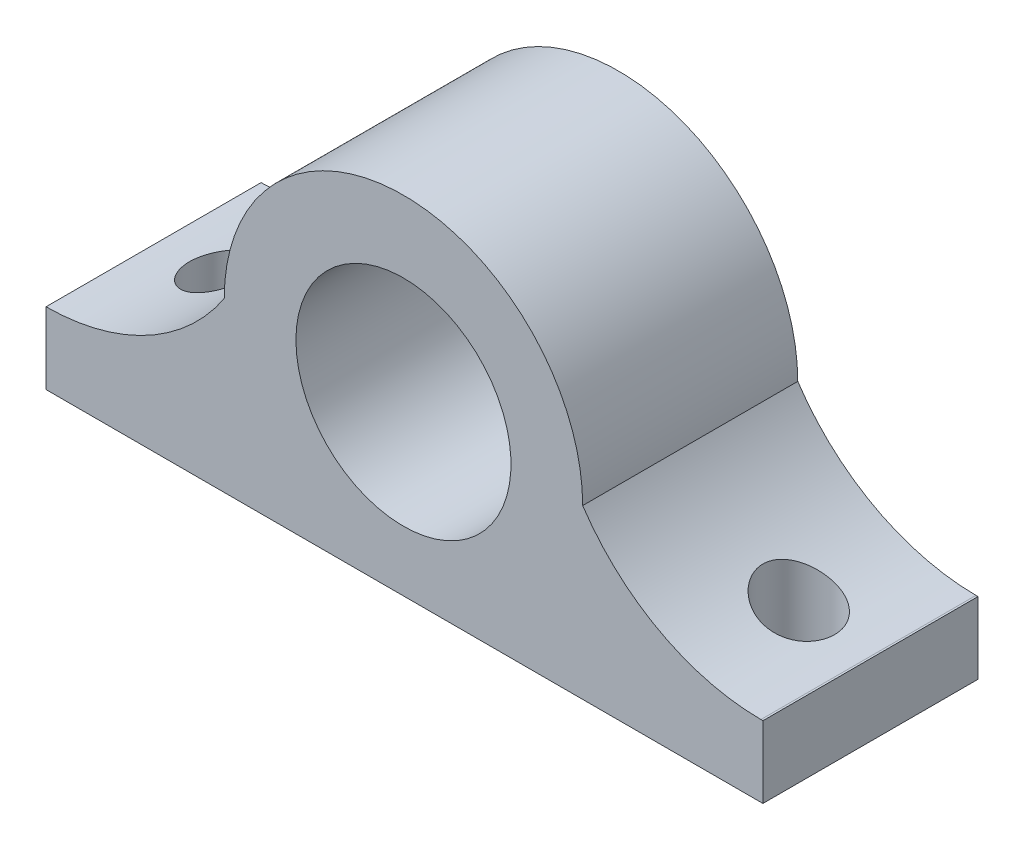
ISO-10303-21;
HEADER;
FILE_DESCRIPTION(('STEP AP214'),'2;1');
FILE_NAME('part.step','',(''),(''),'','','');
FILE_SCHEMA(('AUTOMOTIVE_DESIGN { 1 0 10303 214 1 1 1 1 }'));
ENDSEC;
DATA;
#1=APPLICATION_CONTEXT('core data for automotive mechanical design processes');
#2=APPLICATION_PROTOCOL_DEFINITION('international standard','automotive_design',2000,#1);
#3=PRODUCT_CONTEXT('',#1,'mechanical');
#4=PRODUCT('Part','Part','',(#3));
#5=PRODUCT_RELATED_PRODUCT_CATEGORY('part','',(#4));
#6=PRODUCT_DEFINITION_FORMATION('','',#4);
#7=PRODUCT_DEFINITION_CONTEXT('part definition',#1,'design');
#8=PRODUCT_DEFINITION('design','',#6,#7);
#9=PRODUCT_DEFINITION_SHAPE('','',#8);
#10=(LENGTH_UNIT() NAMED_UNIT(*) SI_UNIT(.MILLI.,.METRE.));
#11=(NAMED_UNIT(*) PLANE_ANGLE_UNIT() SI_UNIT($,.RADIAN.));
#12=(NAMED_UNIT(*) SI_UNIT($,.STERADIAN.) SOLID_ANGLE_UNIT());
#13=UNCERTAINTY_MEASURE_WITH_UNIT(LENGTH_MEASURE(1.E-05),#10,'distance_accuracy_value','');
#14=(GEOMETRIC_REPRESENTATION_CONTEXT(3) GLOBAL_UNCERTAINTY_ASSIGNED_CONTEXT((#13)) GLOBAL_UNIT_ASSIGNED_CONTEXT((#10,
#11,#12)) REPRESENTATION_CONTEXT('',''));
#15=CARTESIAN_POINT('',(0.,0.,0.));
#16=DIRECTION('',(0.,0.,1.));
#17=DIRECTION('',(1.,0.,0.));
#18=AXIS2_PLACEMENT_3D('',#15,#16,#17);
#19=CARTESIAN_POINT('',(5.,0.5,-1.5));
#20=DIRECTION('',(-1.,0.,0.));
#21=DIRECTION('',(0.,0.,1.));
#22=AXIS2_PLACEMENT_3D('',#19,#20,#21);
#23=PLANE('',#22);
#24=DIRECTION('',(0.,0.,-1.));
#25=VECTOR('',#24,1.);
#26=CARTESIAN_POINT('',(5.,-0.5,-1.5));
#27=LINE('',#26,#25);
#28=CARTESIAN_POINT('',(5.,-0.5,1.5));
#29=VERTEX_POINT('',#28);
#30=CARTESIAN_POINT('',(5.,-0.5,-1.5));
#31=VERTEX_POINT('',#30);
#32=EDGE_CURVE('E134',#29,#31,#27,.T.);
#33=ORIENTED_EDGE('',*,*,#32,.T.);
#34=DIRECTION('',(0.,-1.,0.));
#35=VECTOR('',#34,1.);
#36=CARTESIAN_POINT('',(5.,0.5,-1.5));
#37=LINE('',#36,#35);
#38=CARTESIAN_POINT('',(5.,0.5,-1.5));
#39=VERTEX_POINT('',#38);
#40=EDGE_CURVE('E139',#39,#31,#37,.T.);
#41=ORIENTED_EDGE('',*,*,#40,.F.);
#42=DIRECTION('',(0.,0.,-1.));
#43=VECTOR('',#42,1.);
#44=CARTESIAN_POINT('',(5.,0.5,-1.5));
#45=LINE('',#44,#43);
#46=CARTESIAN_POINT('',(5.,0.5,1.5));
#47=VERTEX_POINT('',#46);
#48=EDGE_CURVE('E142',#47,#39,#45,.T.);
#49=ORIENTED_EDGE('',*,*,#48,.F.);
#50=DIRECTION('',(0.,-1.,0.));
#51=VECTOR('',#50,1.);
#52=CARTESIAN_POINT('',(5.,0.5,1.5));
#53=LINE('',#52,#51);
#54=EDGE_CURVE('E75',#47,#29,#53,.T.);
#55=ORIENTED_EDGE('',*,*,#54,.T.);
#56=EDGE_LOOP('',(#33,#41,#49,#55));
#57=FACE_BOUND('',#56,.T.);
#58=ADVANCED_FACE('F40',(#57),#23,.F.);
#59=CARTESIAN_POINT('',(-5.,0.5,-1.5));
#60=DIRECTION('',(0.,0.,1.));
#61=DIRECTION('',(1.,0.,0.));
#62=AXIS2_PLACEMENT_3D('',#59,#60,#61);
#63=PLANE('',#62);
#64=CARTESIAN_POINT('',(-0.0140725174158133,1.8416876048223,-1.5));
#65=DIRECTION('',(0.,0.,-1.));
#66=DIRECTION('',(-1.,0.,0.));
#67=AXIS2_PLACEMENT_3D('',#64,#65,#66);
#68=CIRCLE('',#67,1.5);
#69=CARTESIAN_POINT('',(-1.51407251741581,1.8416876048223,-1.5));
#70=VERTEX_POINT('',#69);
#71=EDGE_CURVE('E329',#70,#70,#68,.T.);
#72=ORIENTED_EDGE('',*,*,#71,.F.);
#73=EDGE_LOOP('',(#72));
#74=FACE_BOUND('',#73,.T.);
#75=ORIENTED_EDGE('',*,*,#40,.T.);
#76=DIRECTION('',(-1.,0.,0.));
#77=VECTOR('',#76,1.);
#78=CARTESIAN_POINT('',(-5.,-0.5,-1.5));
#79=LINE('',#78,#77);
#80=CARTESIAN_POINT('',(-5.,-0.5,-1.5));
#81=VERTEX_POINT('',#80);
#82=EDGE_CURVE('E144',#31,#81,#79,.T.);
#83=ORIENTED_EDGE('',*,*,#82,.T.);
#84=DIRECTION('',(0.,-1.,0.));
#85=VECTOR('',#84,1.);
#86=CARTESIAN_POINT('',(-5.,0.5,-1.5));
#87=LINE('',#86,#85);
#88=CARTESIAN_POINT('',(-5.,0.5,-1.5));
#89=VERTEX_POINT('',#88);
#90=EDGE_CURVE('E153',#89,#81,#87,.T.);
#91=ORIENTED_EDGE('',*,*,#90,.F.);
#92=CARTESIAN_POINT('',(-5.01409447928562,3.49996689075957,-1.5));
#93=DIRECTION('',(0.,0.,1.));
#94=DIRECTION('',(1.,0.,0.));
#95=AXIS2_PLACEMENT_3D('',#92,#93,#94);
#96=CIRCLE('',#95,3.);
#97=CARTESIAN_POINT('',(-2.51407251741581,1.8416876048223,-1.5));
#98=VERTEX_POINT('',#97);
#99=EDGE_CURVE('E131',#89,#98,#96,.T.);
#100=ORIENTED_EDGE('',*,*,#99,.T.);
#101=CARTESIAN_POINT('',(-0.0140725174158133,1.8416876048223,-1.5));
#102=DIRECTION('',(0.,0.,-1.));
#103=DIRECTION('',(-1.,0.,0.));
#104=AXIS2_PLACEMENT_3D('',#101,#102,#103);
#105=CIRCLE('',#104,2.5);
#106=CARTESIAN_POINT('',(2.48592748258419,1.8416876048223,-1.5));
#107=VERTEX_POINT('',#106);
#108=EDGE_CURVE('E109',#98,#107,#105,.T.);
#109=ORIENTED_EDGE('',*,*,#108,.T.);
#110=CARTESIAN_POINT('',(4.98594930820873,3.49996709616292,-1.5));
#111=DIRECTION('',(0.,0.,1.));
#112=DIRECTION('',(-1.,0.,0.));
#113=AXIS2_PLACEMENT_3D('',#110,#111,#112);
#114=CIRCLE('',#113,3.);
#115=CARTESIAN_POINT('',(4.9718986164175,0.5,-1.5));
#116=VERTEX_POINT('',#115);
#117=EDGE_CURVE('E124',#107,#116,#114,.T.);
#118=ORIENTED_EDGE('',*,*,#117,.T.);
#119=DIRECTION('',(1.,0.,0.));
#120=VECTOR('',#119,1.);
#121=CARTESIAN_POINT('',(0.,0.5,-1.5));
#122=LINE('',#121,#120);
#123=EDGE_CURVE('E11',#39,#116,#122,.F.);
#124=ORIENTED_EDGE('',*,*,#123,.F.);
#125=EDGE_LOOP('',(#75,#83,#91,#100,#109,#118,#124));
#126=FACE_BOUND('',#125,.T.);
#127=ADVANCED_FACE('F162',(#74,#126),#63,.F.);
#128=CARTESIAN_POINT('',(-5.,0.5,-1.5));
#129=DIRECTION('',(1.,0.,0.));
#130=DIRECTION('',(0.,0.,-1.));
#131=AXIS2_PLACEMENT_3D('',#128,#129,#130);
#132=PLANE('',#131);
#133=DIRECTION('',(0.,0.,1.));
#134=VECTOR('',#133,1.);
#135=CARTESIAN_POINT('',(-5.,-0.5,-1.5));
#136=LINE('',#135,#134);
#137=CARTESIAN_POINT('',(-5.,-0.5,1.5));
#138=VERTEX_POINT('',#137);
#139=EDGE_CURVE('E147',#81,#138,#136,.T.);
#140=ORIENTED_EDGE('',*,*,#139,.T.);
#141=DIRECTION('',(0.,-1.,0.));
#142=VECTOR('',#141,1.);
#143=CARTESIAN_POINT('',(-5.,0.5,1.5));
#144=LINE('',#143,#142);
#145=CARTESIAN_POINT('',(-5.,0.5,1.5));
#146=VERTEX_POINT('',#145);
#147=EDGE_CURVE('E80',#146,#138,#144,.T.);
#148=ORIENTED_EDGE('',*,*,#147,.F.);
#149=DIRECTION('',(0.,0.,1.));
#150=VECTOR('',#149,1.);
#151=CARTESIAN_POINT('',(-5.,0.5,-1.5));
#152=LINE('',#151,#150);
#153=EDGE_CURVE('E123',#89,#146,#152,.T.);
#154=ORIENTED_EDGE('',*,*,#153,.F.);
#155=ORIENTED_EDGE('',*,*,#90,.T.);
#156=EDGE_LOOP('',(#140,#148,#154,#155));
#157=FACE_BOUND('',#156,.T.);
#158=ADVANCED_FACE('F168',(#157),#132,.F.);
#159=CARTESIAN_POINT('',(-5.,0.5,1.5));
#160=DIRECTION('',(0.,0.,-1.));
#161=DIRECTION('',(-1.,0.,0.));
#162=AXIS2_PLACEMENT_3D('',#159,#160,#161);
#163=PLANE('',#162);
#164=CARTESIAN_POINT('',(-0.0140725174158133,1.8416876048223,1.5));
#165=DIRECTION('',(0.,0.,-1.));
#166=DIRECTION('',(-1.,0.,0.));
#167=AXIS2_PLACEMENT_3D('',#164,#165,#166);
#168=CIRCLE('',#167,1.5);
#169=CARTESIAN_POINT('',(-1.51407251741581,1.8416876048223,1.5));
#170=VERTEX_POINT('',#169);
#171=EDGE_CURVE('E128',#170,#170,#168,.F.);
#172=ORIENTED_EDGE('',*,*,#171,.F.);
#173=EDGE_LOOP('',(#172));
#174=FACE_BOUND('',#173,.T.);
#175=ORIENTED_EDGE('',*,*,#147,.T.);
#176=DIRECTION('',(1.,0.,0.));
#177=VECTOR('',#176,1.);
#178=CARTESIAN_POINT('',(-5.,-0.5,1.5));
#179=LINE('',#178,#177);
#180=EDGE_CURVE('E149',#138,#29,#179,.T.);
#181=ORIENTED_EDGE('',*,*,#180,.T.);
#182=ORIENTED_EDGE('',*,*,#54,.F.);
#183=DIRECTION('',(1.,0.,0.));
#184=VECTOR('',#183,1.);
#185=CARTESIAN_POINT('',(0.,0.5,1.5));
#186=LINE('',#185,#184);
#187=CARTESIAN_POINT('',(4.9718986164175,0.5,1.5));
#188=VERTEX_POINT('',#187);
#189=EDGE_CURVE('E48',#188,#47,#186,.T.);
#190=ORIENTED_EDGE('',*,*,#189,.F.);
#191=CARTESIAN_POINT('',(4.98594930820873,3.49996709616292,1.5));
#192=DIRECTION('',(0.,0.,1.));
#193=DIRECTION('',(-1.,0.,0.));
#194=AXIS2_PLACEMENT_3D('',#191,#192,#193);
#195=CIRCLE('',#194,3.);
#196=CARTESIAN_POINT('',(2.48592748258419,1.8416876048223,1.5));
#197=VERTEX_POINT('',#196);
#198=EDGE_CURVE('E115',#197,#188,#195,.T.);
#199=ORIENTED_EDGE('',*,*,#198,.F.);
#200=CARTESIAN_POINT('',(-0.0140725174158133,1.8416876048223,1.5));
#201=DIRECTION('',(0.,0.,-1.));
#202=DIRECTION('',(-1.,0.,0.));
#203=AXIS2_PLACEMENT_3D('',#200,#201,#202);
#204=CIRCLE('',#203,2.5);
#205=CARTESIAN_POINT('',(-2.51407251741581,1.8416876048223,1.5));
#206=VERTEX_POINT('',#205);
#207=EDGE_CURVE('E107',#206,#197,#204,.T.);
#208=ORIENTED_EDGE('',*,*,#207,.F.);
#209=CARTESIAN_POINT('',(-5.01409447928562,3.49996689075957,1.5));
#210=DIRECTION('',(0.,0.,1.));
#211=DIRECTION('',(1.,0.,0.));
#212=AXIS2_PLACEMENT_3D('',#209,#210,#211);
#213=CIRCLE('',#212,3.);
#214=EDGE_CURVE('E118',#146,#206,#213,.T.);
#215=ORIENTED_EDGE('',*,*,#214,.F.);
#216=EDGE_LOOP('',(#175,#181,#182,#190,#199,#208,#215));
#217=FACE_BOUND('',#216,.T.);
#218=ADVANCED_FACE('F117',(#174,#217),#163,.F.);
#219=CARTESIAN_POINT('',(0.,0.5,0.));
#220=DIRECTION('',(0.,1.,0.));
#221=DIRECTION('',(0.,0.,1.));
#222=AXIS2_PLACEMENT_3D('',#219,#220,#221);
#223=PLANE('',#222);
#224=DIRECTION('',(0.,0.,-1.));
#225=VECTOR('',#224,1.);
#226=CARTESIAN_POINT('',(4.9718986164175,0.5,1.5));
#227=LINE('',#226,#225);
#228=EDGE_CURVE('E136',#188,#116,#227,.T.);
#229=ORIENTED_EDGE('',*,*,#228,.F.);
#230=ORIENTED_EDGE('',*,*,#189,.T.);
#231=ORIENTED_EDGE('',*,*,#48,.T.);
#232=ORIENTED_EDGE('',*,*,#123,.T.);
#233=EDGE_LOOP('',(#229,#230,#231,#232));
#234=FACE_BOUND('',#233,.T.);
#235=ADVANCED_FACE('F157',(#234),#223,.T.);
#236=CARTESIAN_POINT('',(0.,-0.5,0.));
#237=DIRECTION('',(0.,1.,0.));
#238=DIRECTION('',(0.,0.,1.));
#239=AXIS2_PLACEMENT_3D('',#236,#237,#238);
#240=PLANE('',#239);
#241=CARTESIAN_POINT('',(-4.,-0.5,0.));
#242=DIRECTION('',(0.,-1.,0.));
#243=DIRECTION('',(0.,0.,-1.));
#244=AXIS2_PLACEMENT_3D('',#241,#242,#243);
#245=CIRCLE('',#244,0.5);
#246=CARTESIAN_POINT('',(-4.,-0.5,-0.5));
#247=VERTEX_POINT('',#246);
#248=EDGE_CURVE('E330',#247,#247,#245,.T.);
#249=ORIENTED_EDGE('',*,*,#248,.F.);
#250=EDGE_LOOP('',(#249));
#251=FACE_BOUND('',#250,.T.);
#252=CARTESIAN_POINT('',(4.,-0.5,0.));
#253=DIRECTION('',(0.,-1.,0.));
#254=DIRECTION('',(0.,0.,-1.));
#255=AXIS2_PLACEMENT_3D('',#252,#253,#254);
#256=CIRCLE('',#255,0.5);
#257=CARTESIAN_POINT('',(4.,-0.5,-0.5));
#258=VERTEX_POINT('',#257);
#259=EDGE_CURVE('E322',#258,#258,#256,.T.);
#260=ORIENTED_EDGE('',*,*,#259,.F.);
#261=EDGE_LOOP('',(#260));
#262=FACE_BOUND('',#261,.T.);
#263=ORIENTED_EDGE('',*,*,#32,.F.);
#264=ORIENTED_EDGE('',*,*,#180,.F.);
#265=ORIENTED_EDGE('',*,*,#139,.F.);
#266=ORIENTED_EDGE('',*,*,#82,.F.);
#267=EDGE_LOOP('',(#263,#264,#265,#266));
#268=FACE_BOUND('',#267,.T.);
#269=ADVANCED_FACE('F166',(#251,#262,#268),#240,.F.);
#270=CARTESIAN_POINT('',(-5.01409447928562,3.49996689075957,1.5));
#271=DIRECTION('',(0.,0.,-1.));
#272=DIRECTION('',(-1.,0.,0.));
#273=AXIS2_PLACEMENT_3D('',#270,#271,#272);
#274=CYLINDRICAL_SURFACE('',#273,3.);
#275=CARTESIAN_POINT('',(-4.,0.676562494098971,-0.5));
#276=CARTESIAN_POINT('',(-3.9697015571989,0.687445760517024,-0.499998780526055));
#277=CARTESIAN_POINT('',(-3.93955596487377,0.698829165498158,-0.49723843872681));
#278=CARTESIAN_POINT('',(-3.88044685976339,0.722223544406641,-0.486428692570605));
#279=CARTESIAN_POINT('',(-3.85148543777795,0.734235549618095,-0.478370328856497));
#280=CARTESIAN_POINT('',(-3.79556669381838,0.758413291523463,-0.457272661543686));
#281=CARTESIAN_POINT('',(-3.76860621412545,0.770578748950053,-0.444241414363061));
#282=CARTESIAN_POINT('',(-3.71732431768564,0.794566895756951,-0.413507139634476));
#283=CARTESIAN_POINT('',(-3.69300261184666,0.806389622581064,-0.395804624580264));
#284=CARTESIAN_POINT('',(-3.64745417933502,0.829208611630001,-0.355862084056684));
#285=CARTESIAN_POINT('',(-3.62626011854232,0.840195639275941,-0.333579292041154));
#286=CARTESIAN_POINT('',(-3.58803174648391,0.860494503206035,-0.28501809570474));
#287=CARTESIAN_POINT('',(-3.57099546287802,0.869807133226234,-0.258741595531496));
#288=CARTESIAN_POINT('',(-3.54310099737436,0.885313354443617,-0.205135004906425));
#289=CARTESIAN_POINT('',(-3.53185267527456,0.891699188881653,-0.178064978705388));
#290=CARTESIAN_POINT('',(-3.51420562045062,0.90180618931694,-0.121927075059789));
#291=CARTESIAN_POINT('',(-3.50780051675419,0.905530855569291,-0.0928618772719159));
#292=CARTESIAN_POINT('',(-3.50075646281827,0.909634536390621,-0.0377358983577975));
#293=CARTESIAN_POINT('',(-3.49946836929394,0.910390054380368,-0.0117845238320152));
#294=CARTESIAN_POINT('',(-3.5009286869846,0.909536371315639,0.0399617367295928));
#295=CARTESIAN_POINT('',(-3.50367594872372,0.907927843662382,0.0657566652278292));
#296=CARTESIAN_POINT('',(-3.51277550808274,0.902647840675234,0.114893313429117));
#297=CARTESIAN_POINT('',(-3.51890775565268,0.89910241131674,0.138290304490793));
#298=CARTESIAN_POINT('',(-3.53433827370248,0.890292571923851,0.183667641809303));
#299=CARTESIAN_POINT('',(-3.54363713415735,0.885027841572155,0.205647723171958));
#300=CARTESIAN_POINT('',(-3.56572336110698,0.872726918715533,0.249064735913569));
#301=CARTESIAN_POINT('',(-3.57869068855583,0.865601411806657,0.270384312400276));
#302=CARTESIAN_POINT('',(-3.60738868481018,0.850166105712074,0.310591775039013));
#303=CARTESIAN_POINT('',(-3.62312060114905,0.841855772188753,0.329478556684887));
#304=CARTESIAN_POINT('',(-3.65902478377479,0.823356845462942,0.366720856837962));
#305=CARTESIAN_POINT('',(-3.67950497006507,0.813062887093036,0.384727397357553));
#306=CARTESIAN_POINT('',(-3.72292454028443,0.791929993855863,0.417088984767865));
#307=CARTESIAN_POINT('',(-3.74586517514443,0.781090783274958,0.43144216160227));
#308=CARTESIAN_POINT('',(-3.79608315754079,0.758200726415497,0.457487358951971));
#309=CARTESIAN_POINT('',(-3.82356499714184,0.74613616934017,0.468775213973306));
#310=CARTESIAN_POINT('',(-3.8802228929702,0.722327674362302,0.486346969868822));
#311=CARTESIAN_POINT('',(-3.90939927664833,0.710583799076669,0.492629900124935));
#312=CARTESIAN_POINT('',(-3.96922890840976,0.687619109669509,0.499977351192788));
#313=CARTESIAN_POINT('',(-3.9998993134211,0.676411574766918,0.500945564989827));
#314=CARTESIAN_POINT('',(-4.06128138385853,0.655111627004658,0.497181141883999));
#315=CARTESIAN_POINT('',(-4.09199303353715,0.645018869363298,0.492450273030893));
#316=CARTESIAN_POINT('',(-4.1508906411069,0.62667893584044,0.477606386630997));
#317=CARTESIAN_POINT('',(-4.17912617824643,0.618364826950105,0.467773505647206));
#318=CARTESIAN_POINT('',(-4.23368690329045,0.603112346042826,0.443042260848216));
#319=CARTESIAN_POINT('',(-4.26001280160237,0.59617346074566,0.428145792593672));
#320=CARTESIAN_POINT('',(-4.3082665421938,0.584081116848844,0.394691869527815));
#321=CARTESIAN_POINT('',(-4.3303634577818,0.578845540937164,0.376407539388483));
#322=CARTESIAN_POINT('',(-4.37122429031954,0.569581662839983,0.336175530801219));
#323=CARTESIAN_POINT('',(-4.38998886718115,0.56555312151339,0.314228579345487));
#324=CARTESIAN_POINT('',(-4.42295486301791,0.558737776687048,0.268114467012552));
#325=CARTESIAN_POINT('',(-4.43728958831875,0.555913455016393,0.24404799551992));
#326=CARTESIAN_POINT('',(-4.46176707765042,0.551223005459782,0.193784291323359));
#327=CARTESIAN_POINT('',(-4.47191013680056,0.549356810113546,0.167587208783149));
#328=CARTESIAN_POINT('',(-4.48759260326833,0.546518218014006,0.114112239977678));
#329=CARTESIAN_POINT('',(-4.49318041197564,0.545536412180547,0.0868490313619798));
#330=CARTESIAN_POINT('',(-4.49976101638912,0.5443836170434,0.0317567013761077));
#331=CARTESIAN_POINT('',(-4.50075387154059,0.544212617250245,0.0039275873317781));
#332=CARTESIAN_POINT('',(-4.49811602750659,0.544671995628689,-0.0514557575614279));
#333=CARTESIAN_POINT('',(-4.49449326924186,0.545300997436285,-0.0790103785440275));
#334=CARTESIAN_POINT('',(-4.48275006374214,0.547390340009129,-0.133110973844658));
#335=CARTESIAN_POINT('',(-4.47462966094945,0.548850672559805,-0.159656958126496));
#336=CARTESIAN_POINT('',(-4.45414382655911,0.552669286426031,-0.210990865155317));
#337=CARTESIAN_POINT('',(-4.44177796188429,0.555027659352854,-0.235778608233715));
#338=CARTESIAN_POINT('',(-4.41319411224358,0.560727152787153,-0.282895424725531));
#339=CARTESIAN_POINT('',(-4.39697635315111,0.564068215672853,-0.305224642193498));
#340=CARTESIAN_POINT('',(-4.361162578409,0.571824900383542,-0.346868422673887));
#341=CARTESIAN_POINT('',(-4.34155817774193,0.576243200794471,-0.366175270860861));
#342=CARTESIAN_POINT('',(-4.29962468857346,0.586207038995609,-0.401212852578282));
#343=CARTESIAN_POINT('',(-4.2772949795438,0.591752833698246,-0.416942769330435));
#344=CARTESIAN_POINT('',(-4.23029526388173,0.60406347430525,-0.444655915080291));
#345=CARTESIAN_POINT('',(-4.20559718980962,0.610844101694315,-0.456584386445126));
#346=CARTESIAN_POINT('',(-4.15489849787171,0.625514473601192,-0.476176494154752));
#347=CARTESIAN_POINT('',(-4.12889899715849,0.633403277017101,-0.483843722193548));
#348=CARTESIAN_POINT('',(-4.08563697708469,0.64719871969601,-0.492918088522056));
#349=CARTESIAN_POINT('',(-4.06853469039136,0.652820326115253,-0.495580037014761));
#350=CARTESIAN_POINT('',(-4.0342720169045,0.66442895013099,-0.499121315627832));
#351=CARTESIAN_POINT('',(-4.01711163152157,0.670415958914992,-0.500000688721494));
#352=CARTESIAN_POINT('',(-4.,0.676562494098971,-0.5));
#353=B_SPLINE_CURVE_WITH_KNOTS('',3,(#275,#276,#277,#278,#279,#280,#281,#282,#283,#284,#285,
#286,#287,#288,#289,#290,#291,#292,#293,#294,#295,#296,#297,#298,#299,#300,#301,#302,#303,#304,
#305,#306,#307,#308,#309,#310,#311,#312,#313,#314,#315,#316,#317,#318,#319,#320,#321,#322,#323,
#324,#325,#326,#327,#328,#329,#330,#331,#332,#333,#334,#335,#336,#337,#338,#339,#340,#341,#342,
#343,#344,#345,#346,#347,#348,#349,#350,#351,#352),.UNSPECIFIED.,.T.,.F.,(4,2,2,2,2,2,2,2,2,2,2,
2,2,2,2,2,2,2,2,2,2,2,2,2,2,2,2,2,2,2,2,2,2,2,2,2,2,2,4),(0.,0.0965128355599916,
0.193189302907238,0.289709808018864,0.386219728080558,0.483675424485014,0.581084800216255,
0.670561491261498,0.75992027517298,0.83749217208269,0.915041976827289,0.988059984059965,
1.06109160280518,1.13863301271082,1.21620950380755,1.30329630833571,1.39042760096027,
1.48618545413285,1.58196187335682,1.67946824823578,1.77694438110116,1.86955999437084,
1.9621409749752,2.04916984636391,2.13618146392871,2.22023863458997,2.30428988609618,
2.38743597113147,2.47058098049593,2.55358313620939,2.63658447177364,2.71959427677456,
2.80259921531778,2.88581269180901,2.96904515073367,3.05342736695611,3.13773835126233,
3.19224715571461,3.24675464608451),.UNSPECIFIED.);
#354=CARTESIAN_POINT('',(-4.,0.676562494098971,-0.5));
#355=VERTEX_POINT('',#354);
#356=EDGE_CURVE('E321',#355,#355,#353,.T.);
#357=ORIENTED_EDGE('',*,*,#356,.T.);
#358=EDGE_LOOP('',(#357));
#359=FACE_BOUND('',#358,.T.);
#360=ORIENTED_EDGE('',*,*,#99,.F.);
#361=ORIENTED_EDGE('',*,*,#153,.T.);
#362=ORIENTED_EDGE('',*,*,#214,.T.);
#363=DIRECTION('',(0.,0.,-1.));
#364=VECTOR('',#363,1.);
#365=CARTESIAN_POINT('',(-2.51407251741581,1.8416876048223,1.5));
#366=LINE('',#365,#364);
#367=EDGE_CURVE('E104',#206,#98,#366,.T.);
#368=ORIENTED_EDGE('',*,*,#367,.T.);
#369=EDGE_LOOP('',(#360,#361,#362,#368));
#370=FACE_BOUND('',#369,.T.);
#371=ADVANCED_FACE('F122',(#359,#370),#274,.F.);
#372=CARTESIAN_POINT('',(4.98594930820873,3.49996709616292,1.5));
#373=DIRECTION('',(0.,0.,-1.));
#374=DIRECTION('',(-1.,0.,0.));
#375=AXIS2_PLACEMENT_3D('',#372,#373,#374);
#376=CYLINDRICAL_SURFACE('',#375,3.);
#377=CARTESIAN_POINT('',(4.,0.666611495176217,-0.5));
#378=CARTESIAN_POINT('',(4.02802763914415,0.65685881326369,-0.49999926932413));
#379=CARTESIAN_POINT('',(4.05621130315676,0.64752165059548,-0.497638275676801));
#380=CARTESIAN_POINT('',(4.11210468071728,0.629905251380258,-0.488094816874863));
#381=CARTESIAN_POINT('',(4.13981423174606,0.621626371544792,-0.480910731092632));
#382=CARTESIAN_POINT('',(4.19394697158417,0.606262618300235,-0.461746927289285));
#383=CARTESIAN_POINT('',(4.22036756482799,0.599180088670255,-0.449757947368562));
#384=CARTESIAN_POINT('',(4.27096122414594,0.58629686445823,-0.421216232116571));
#385=CARTESIAN_POINT('',(4.29513477179812,0.580495894848647,-0.404664477690829));
#386=CARTESIAN_POINT('',(4.33952603043207,0.570353269028233,-0.368127113279928));
#387=CARTESIAN_POINT('',(4.35985774540095,0.565965211334602,-0.348292796029901));
#388=CARTESIAN_POINT('',(4.39695122192929,0.558293943532574,-0.305343331363897));
#389=CARTESIAN_POINT('',(4.41371340309768,0.555010603535098,-0.282228570106456));
#390=CARTESIAN_POINT('',(4.44274225641312,0.549519692831097,-0.233992479760349));
#391=CARTESIAN_POINT('',(4.45510851652635,0.547287858724391,-0.208933767799148));
#392=CARTESIAN_POINT('',(4.47551130678172,0.543692240357929,-0.15705358782393));
#393=CARTESIAN_POINT('',(4.48354803311163,0.542328416764785,-0.130232199745323));
#394=CARTESIAN_POINT('',(4.49500407760092,0.540405194489712,-0.0757673030768332));
#395=CARTESIAN_POINT('',(4.49845163305945,0.539840875040218,-0.0481299017758397));
#396=CARTESIAN_POINT('',(4.50071607470612,0.539468807958784,0.00733907242736407));
#397=CARTESIAN_POINT('',(4.49953299117166,0.539661055380036,0.0351706440588051));
#398=CARTESIAN_POINT('',(4.49257426806891,0.540812950689155,0.0902214864791719));
#399=CARTESIAN_POINT('',(4.48680119180241,0.541772170259717,0.117441090302552));
#400=CARTESIAN_POINT('',(4.4708435818117,0.5445092470475,0.170511141101989));
#401=CARTESIAN_POINT('',(4.46065911356855,0.54628709211337,0.19636160839461));
#402=CARTESIAN_POINT('',(4.43619447725459,0.550742883412036,0.245965913509299));
#403=CARTESIAN_POINT('',(4.4219137145629,0.553420960332808,0.269719446283794));
#404=CARTESIAN_POINT('',(4.38970951751431,0.559768712849258,0.31446180055057));
#405=CARTESIAN_POINT('',(4.37178617171132,0.563438364339733,0.33545068923297));
#406=CARTESIAN_POINT('',(4.33280618638141,0.571861581489227,0.374161610816496));
#407=CARTESIAN_POINT('',(4.31173979437123,0.576618546298482,0.391873076810938));
#408=CARTESIAN_POINT('',(4.26718739202643,0.587252709786299,0.42350616800322));
#409=CARTESIAN_POINT('',(4.24370129744667,0.593129947474697,0.437427661186653));
#410=CARTESIAN_POINT('',(4.19464708462126,0.606095338807654,0.461377590838772));
#411=CARTESIAN_POINT('',(4.16905185139197,0.613201220578388,0.471340775879019));
#412=CARTESIAN_POINT('',(4.11687654659906,0.628477643721553,0.486910209728938));
#413=CARTESIAN_POINT('',(4.09029630830441,0.636648365933227,0.492515717356132));
#414=CARTESIAN_POINT('',(4.03581953836416,0.654250254833337,0.499500375296218));
#415=CARTESIAN_POINT('',(4.00791253950539,0.663718503387986,0.500703514128499));
#416=CARTESIAN_POINT('',(3.95255296529224,0.683416662076748,0.498514692326567));
#417=CARTESIAN_POINT('',(3.92510052246188,0.693646789715657,0.495121414696939));
#418=CARTESIAN_POINT('',(3.86973241916939,0.715188422854702,0.48360684961168));
#419=CARTESIAN_POINT('',(3.84188239523528,0.726528228165945,0.47522250881331));
#420=CARTESIAN_POINT('',(3.78808381976077,0.749335668800707,0.453795789408594));
#421=CARTESIAN_POINT('',(3.76213598204416,0.760803350270585,0.440751672827037));
#422=CARTESIAN_POINT('',(3.71176806550765,0.783855933225797,0.409674351951233));
#423=CARTESIAN_POINT('',(3.68745262128716,0.795426727643684,0.391460269270584));
#424=CARTESIAN_POINT('',(3.64227143295653,0.817586861638386,0.350651687633831));
#425=CARTESIAN_POINT('',(3.62140590729812,0.82817613904608,0.328056911485211));
#426=CARTESIAN_POINT('',(3.58452022036014,0.847342910536114,0.279765227843938));
#427=CARTESIAN_POINT('',(3.56836201006013,0.855975592632863,0.254196457871508));
#428=CARTESIAN_POINT('',(3.5407516721986,0.870964913125487,0.200029889754094));
#429=CARTESIAN_POINT('',(3.52929409659224,0.877324185301653,0.171435646786277));
#430=CARTESIAN_POINT('',(3.51278620006953,0.886565141628815,0.115622964503682));
#431=CARTESIAN_POINT('',(3.50714500753242,0.889765618590237,0.0886322354458437));
#432=CARTESIAN_POINT('',(3.50039252907743,0.893602327090357,0.033916780021967));
#433=CARTESIAN_POINT('',(3.49927783468531,0.894240488060891,0.00619262177179291));
#434=CARTESIAN_POINT('',(3.50151739242493,0.892964577269802,-0.0461613956205524));
#435=CARTESIAN_POINT('',(3.50442705690977,0.891304395040449,-0.0708182181333565));
#436=CARTESIAN_POINT('',(3.51379691070465,0.886005354412234,-0.119223414781205));
#437=CARTESIAN_POINT('',(3.52025723853908,0.882366418815015,-0.1429717534343));
#438=CARTESIAN_POINT('',(3.53650972065215,0.873332136789884,-0.189159964523694));
#439=CARTESIAN_POINT('',(3.54632878306267,0.867922621141755,-0.211587499356007));
#440=CARTESIAN_POINT('',(3.5689205384502,0.855691375636044,-0.254477128406243));
#441=CARTESIAN_POINT('',(3.58169412766328,0.84886921732862,-0.274938623567945));
#442=CARTESIAN_POINT('',(3.611233762359,0.833422254741795,-0.315519139016575));
#443=CARTESIAN_POINT('',(3.62827209496477,0.824685171369432,-0.335396881300979));
#444=CARTESIAN_POINT('',(3.66499612797643,0.806362803551772,-0.372084705932133));
#445=CARTESIAN_POINT('',(3.68468356856805,0.796776962989709,-0.388892754558067));
#446=CARTESIAN_POINT('',(3.72865280338676,0.776024836415188,-0.420943337543077));
#447=CARTESIAN_POINT('',(3.75320258234939,0.764803576349925,-0.435783512758685));
#448=CARTESIAN_POINT('',(3.80443266141894,0.74228687450102,-0.461051713335565));
#449=CARTESIAN_POINT('',(3.83111217539728,0.730991461488769,-0.471481357843132));
#450=CARTESIAN_POINT('',(3.88134035354297,0.710622127573804,-0.486297185418712));
#451=CARTESIAN_POINT('',(3.90465660616499,0.7014952557936,-0.491406631869529));
#452=CARTESIAN_POINT('',(3.95194353730397,0.683680493787115,-0.498258200868703));
#453=CARTESIAN_POINT('',(3.97591415644436,0.674992563934269,-0.500000627913917));
#454=CARTESIAN_POINT('',(4.,0.666611495176217,-0.5));
#455=B_SPLINE_CURVE_WITH_KNOTS('',3,(#377,#378,#379,#380,#381,#382,#383,#384,#385,#386,#387,
#388,#389,#390,#391,#392,#393,#394,#395,#396,#397,#398,#399,#400,#401,#402,#403,#404,#405,#406,
#407,#408,#409,#410,#411,#412,#413,#414,#415,#416,#417,#418,#419,#420,#421,#422,#423,#424,#425,
#426,#427,#428,#429,#430,#431,#432,#433,#434,#435,#436,#437,#438,#439,#440,#441,#442,#443,#444,
#445,#446,#447,#448,#449,#450,#451,#452,#453,#454),.UNSPECIFIED.,.T.,.F.,(4,2,2,2,2,2,2,2,2,2,2,
2,2,2,2,2,2,2,2,2,2,2,2,2,2,2,2,2,2,2,2,2,2,2,2,2,2,2,4),(0.,0.0889430721186556,
0.177916045343733,0.267061353888826,0.356187512895765,0.441985799199927,0.527773994095202,
0.611471824088214,0.695165861092998,0.778342508555883,0.861518612169725,0.944648298318324,
1.02777675056289,1.11091727590192,1.19405578027449,1.27745783513919,1.3608627947383,
1.4455906674829,1.53033294815109,1.6184284355449,1.70654916997603,1.79978586298414,
1.89305736722424,1.99011149013991,2.0871717562523,2.18100452156632,2.27472822518439,
2.35753483416621,2.44027907780933,2.51457653417514,2.58887688936263,2.6637870037639,
2.73871987152114,2.82118673894812,2.90370804534308,2.99571988781639,3.0876979225129,
3.1641389910011,3.2405731462073),.UNSPECIFIED.);
#456=CARTESIAN_POINT('',(4.,0.666611495176217,-0.5));
#457=VERTEX_POINT('',#456);
#458=EDGE_CURVE('E315',#457,#457,#455,.T.);
#459=ORIENTED_EDGE('',*,*,#458,.T.);
#460=EDGE_LOOP('',(#459));
#461=FACE_BOUND('',#460,.T.);
#462=ORIENTED_EDGE('',*,*,#198,.T.);
#463=ORIENTED_EDGE('',*,*,#228,.T.);
#464=ORIENTED_EDGE('',*,*,#117,.F.);
#465=DIRECTION('',(0.,0.,-1.));
#466=VECTOR('',#465,1.);
#467=CARTESIAN_POINT('',(2.48592748258419,1.8416876048223,1.5));
#468=LINE('',#467,#466);
#469=EDGE_CURVE('E114',#197,#107,#468,.T.);
#470=ORIENTED_EDGE('',*,*,#469,.F.);
#471=EDGE_LOOP('',(#462,#463,#464,#470));
#472=FACE_BOUND('',#471,.T.);
#473=ADVANCED_FACE('F171',(#461,#472),#376,.F.);
#474=CARTESIAN_POINT('',(-0.0140725174158133,1.8416876048223,1.5));
#475=DIRECTION('',(0.,0.,-1.));
#476=DIRECTION('',(-1.,0.,0.));
#477=AXIS2_PLACEMENT_3D('',#474,#475,#476);
#478=CYLINDRICAL_SURFACE('',#477,2.5);
#479=ORIENTED_EDGE('',*,*,#108,.F.);
#480=ORIENTED_EDGE('',*,*,#367,.F.);
#481=ORIENTED_EDGE('',*,*,#207,.T.);
#482=ORIENTED_EDGE('',*,*,#469,.T.);
#483=EDGE_LOOP('',(#479,#480,#481,#482));
#484=FACE_BOUND('',#483,.T.);
#485=ADVANCED_FACE('F106',(#484),#478,.T.);
#486=CARTESIAN_POINT('',(-0.0140725174158133,1.8416876048223,1.501));
#487=DIRECTION('',(0.,0.,-1.));
#488=DIRECTION('',(-1.,0.,0.));
#489=AXIS2_PLACEMENT_3D('',#486,#487,#488);
#490=CYLINDRICAL_SURFACE('',#489,1.5);
#491=CARTESIAN_POINT('',(-1.51407251741581,1.8416876048223,-1.5));
#492=CARTESIAN_POINT('',(-1.51407251741581,1.8416876048223,-1.46875));
#493=CARTESIAN_POINT('',(-1.51407251741581,1.8416876048223,-1.4375));
#494=CARTESIAN_POINT('',(-1.51407251741581,1.8416876048223,-1.375));
#495=CARTESIAN_POINT('',(-1.51407251741581,1.8416876048223,-1.34375));
#496=CARTESIAN_POINT('',(-1.51407251741581,1.8416876048223,-1.28125));
#497=CARTESIAN_POINT('',(-1.51407251741581,1.8416876048223,-1.25));
#498=CARTESIAN_POINT('',(-1.51407251741581,1.8416876048223,-1.1875));
#499=CARTESIAN_POINT('',(-1.51407251741581,1.8416876048223,-1.15625));
#500=CARTESIAN_POINT('',(-1.51407251741581,1.8416876048223,-1.09375));
#501=CARTESIAN_POINT('',(-1.51407251741581,1.8416876048223,-1.0625));
#502=CARTESIAN_POINT('',(-1.51407251741581,1.8416876048223,-1.));
#503=CARTESIAN_POINT('',(-1.51407251741581,1.8416876048223,-0.96875));
#504=CARTESIAN_POINT('',(-1.51407251741581,1.8416876048223,-0.90625));
#505=CARTESIAN_POINT('',(-1.51407251741581,1.8416876048223,-0.874999999999999));
#506=CARTESIAN_POINT('',(-1.51407251741581,1.8416876048223,-0.8125));
#507=CARTESIAN_POINT('',(-1.51407251741581,1.8416876048223,-0.78125));
#508=CARTESIAN_POINT('',(-1.51407251741581,1.8416876048223,-0.71875));
#509=CARTESIAN_POINT('',(-1.51407251741581,1.8416876048223,-0.6875));
#510=CARTESIAN_POINT('',(-1.51407251741581,1.8416876048223,-0.625));
#511=CARTESIAN_POINT('',(-1.51407251741581,1.8416876048223,-0.59375));
#512=CARTESIAN_POINT('',(-1.51407251741581,1.8416876048223,-0.53125));
#513=CARTESIAN_POINT('',(-1.51407251741581,1.8416876048223,-0.5));
#514=CARTESIAN_POINT('',(-1.51407251741581,1.8416876048223,-0.4375));
#515=CARTESIAN_POINT('',(-1.51407251741581,1.8416876048223,-0.40625));
#516=CARTESIAN_POINT('',(-1.51407251741581,1.8416876048223,-0.34375));
#517=CARTESIAN_POINT('',(-1.51407251741581,1.8416876048223,-0.3125));
#518=CARTESIAN_POINT('',(-1.51407251741581,1.8416876048223,-0.25));
#519=CARTESIAN_POINT('',(-1.51407251741581,1.8416876048223,-0.21875));
#520=CARTESIAN_POINT('',(-1.51407251741581,1.8416876048223,-0.15625));
#521=CARTESIAN_POINT('',(-1.51407251741581,1.8416876048223,-0.125));
#522=CARTESIAN_POINT('',(-1.51407251741581,1.8416876048223,-0.0624999999999998));
#523=CARTESIAN_POINT('',(-1.51407251741581,1.8416876048223,-0.0312499999999998));
#524=CARTESIAN_POINT('',(-1.51407251741581,1.8416876048223,0.0312500000000002));
#525=CARTESIAN_POINT('',(-1.51407251741581,1.8416876048223,0.0625000000000003));
#526=CARTESIAN_POINT('',(-1.51407251741581,1.8416876048223,0.125));
#527=CARTESIAN_POINT('',(-1.51407251741581,1.8416876048223,0.15625));
#528=CARTESIAN_POINT('',(-1.51407251741581,1.8416876048223,0.21875));
#529=CARTESIAN_POINT('',(-1.51407251741581,1.8416876048223,0.25));
#530=CARTESIAN_POINT('',(-1.51407251741581,1.8416876048223,0.3125));
#531=CARTESIAN_POINT('',(-1.51407251741581,1.8416876048223,0.34375));
#532=CARTESIAN_POINT('',(-1.51407251741581,1.8416876048223,0.40625));
#533=CARTESIAN_POINT('',(-1.51407251741581,1.8416876048223,0.4375));
#534=CARTESIAN_POINT('',(-1.51407251741581,1.8416876048223,0.5));
#535=CARTESIAN_POINT('',(-1.51407251741581,1.8416876048223,0.53125));
#536=CARTESIAN_POINT('',(-1.51407251741581,1.8416876048223,0.59375));
#537=CARTESIAN_POINT('',(-1.51407251741581,1.8416876048223,0.625));
#538=CARTESIAN_POINT('',(-1.51407251741581,1.8416876048223,0.6875));
#539=CARTESIAN_POINT('',(-1.51407251741581,1.8416876048223,0.71875));
#540=CARTESIAN_POINT('',(-1.51407251741581,1.8416876048223,0.78125));
#541=CARTESIAN_POINT('',(-1.51407251741581,1.8416876048223,0.8125));
#542=CARTESIAN_POINT('',(-1.51407251741581,1.8416876048223,0.875));
#543=CARTESIAN_POINT('',(-1.51407251741581,1.8416876048223,0.90625));
#544=CARTESIAN_POINT('',(-1.51407251741581,1.8416876048223,0.96875));
#545=CARTESIAN_POINT('',(-1.51407251741581,1.8416876048223,1.));
#546=CARTESIAN_POINT('',(-1.51407251741581,1.8416876048223,1.0625));
#547=CARTESIAN_POINT('',(-1.51407251741581,1.8416876048223,1.09375));
#548=CARTESIAN_POINT('',(-1.51407251741581,1.8416876048223,1.15625));
#549=CARTESIAN_POINT('',(-1.51407251741581,1.8416876048223,1.1875));
#550=CARTESIAN_POINT('',(-1.51407251741581,1.8416876048223,1.25));
#551=CARTESIAN_POINT('',(-1.51407251741581,1.8416876048223,1.28125));
#552=CARTESIAN_POINT('',(-1.51407251741581,1.8416876048223,1.34375));
#553=CARTESIAN_POINT('',(-1.51407251741581,1.8416876048223,1.375));
#554=CARTESIAN_POINT('',(-1.51407251741581,1.8416876048223,1.4375));
#555=CARTESIAN_POINT('',(-1.51407251741581,1.8416876048223,1.46875));
#556=CARTESIAN_POINT('',(-1.51407251741581,1.8416876048223,1.5));
#557=B_SPLINE_CURVE_WITH_KNOTS('',3,(#491,#492,#493,#494,#495,#496,#497,#498,#499,#500,#501,
#502,#503,#504,#505,#506,#507,#508,#509,#510,#511,#512,#513,#514,#515,#516,#517,#518,#519,#520,
#521,#522,#523,#524,#525,#526,#527,#528,#529,#530,#531,#532,#533,#534,#535,#536,#537,#538,#539,
#540,#541,#542,#543,#544,#545,#546,#547,#548,#549,#550,#551,#552,#553,#554,#555,#556),
.UNSPECIFIED.,.F.,.F.,(4,2,2,2,2,2,2,2,2,2,2,2,2,2,2,2,2,2,2,2,2,2,2,2,2,2,2,2,2,2,2,2,4),(0.,
0.0937500000000001,0.1875,0.28125,0.375,0.46875,0.5625,0.65625,0.75,0.84375,0.9375,1.03125,
1.125,1.21875,1.3125,1.40625,1.5,1.59375,1.6875,1.78125,1.875,1.96875,2.0625,2.15625,2.25,
2.34375,2.4375,2.53125,2.625,2.71875,2.8125,2.90625,3.),.UNSPECIFIED.);
#558=EDGE_CURVE('BSEAM179',#70,#170,#557,.T.);
#559=ORIENTED_EDGE('',*,*,#71,.T.);
#560=ORIENTED_EDGE('',*,*,#171,.T.);
#561=ORIENTED_EDGE('',*,*,#558,.T.);
#562=ORIENTED_EDGE('',*,*,#558,.F.);
#563=EDGE_LOOP('',(#559,#561,#560,#562));
#564=FACE_BOUND('',#563,.T.);
#565=ADVANCED_FACE('F179',(#564),#490,.F.);
#566=CARTESIAN_POINT('',(4.,4.3426876048223,0.));
#567=DIRECTION('',(0.,-1.,0.));
#568=DIRECTION('',(0.,0.,-1.));
#569=AXIS2_PLACEMENT_3D('',#566,#567,#568);
#570=CYLINDRICAL_SURFACE('',#569,0.5);
#571=ORIENTED_EDGE('',*,*,#458,.F.);
#572=EDGE_LOOP('',(#571));
#573=FACE_BOUND('',#572,.T.);
#574=ORIENTED_EDGE('',*,*,#259,.T.);
#575=EDGE_LOOP('',(#574));
#576=FACE_BOUND('',#575,.T.);
#577=ADVANCED_FACE('F231',(#573,#576),#570,.F.);
#578=CARTESIAN_POINT('',(-4.,4.3426876048223,0.));
#579=DIRECTION('',(0.,-1.,0.));
#580=DIRECTION('',(0.,0.,-1.));
#581=AXIS2_PLACEMENT_3D('',#578,#579,#580);
#582=CYLINDRICAL_SURFACE('',#581,0.5);
#583=ORIENTED_EDGE('',*,*,#356,.F.);
#584=EDGE_LOOP('',(#583));
#585=FACE_BOUND('',#584,.T.);
#586=ORIENTED_EDGE('',*,*,#248,.T.);
#587=EDGE_LOOP('',(#586));
#588=FACE_BOUND('',#587,.T.);
#589=ADVANCED_FACE('F236',(#585,#588),#582,.F.);
#590=CLOSED_SHELL('',(#58,#127,#158,#218,#235,#269,#371,#473,#485,#565,#577,#589));
#591=MANIFOLD_SOLID_BREP('B2',#590);
#592=ADVANCED_BREP_SHAPE_REPRESENTATION('',(#18,#591),#14);
#593=SHAPE_DEFINITION_REPRESENTATION(#9,#592);
ENDSEC;
END-ISO-10303-21;
